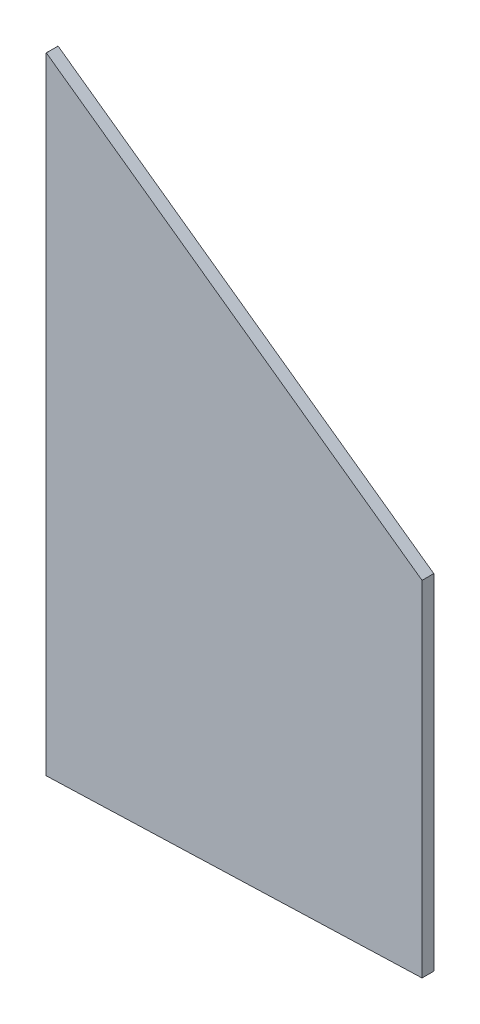
ISO-10303-21;
HEADER;
FILE_DESCRIPTION(('STEP AP214'),'2;1');
FILE_NAME('part.step','',(''),(''),'','','');
FILE_SCHEMA(('AUTOMOTIVE_DESIGN { 1 0 10303 214 1 1 1 1 }'));
ENDSEC;
DATA;
#1=APPLICATION_CONTEXT('core data for automotive mechanical design processes');
#2=APPLICATION_PROTOCOL_DEFINITION('international standard','automotive_design',2000,#1);
#3=PRODUCT_CONTEXT('',#1,'mechanical');
#4=PRODUCT('Part','Part','',(#3));
#5=PRODUCT_RELATED_PRODUCT_CATEGORY('part','',(#4));
#6=PRODUCT_DEFINITION_FORMATION('','',#4);
#7=PRODUCT_DEFINITION_CONTEXT('part definition',#1,'design');
#8=PRODUCT_DEFINITION('design','',#6,#7);
#9=PRODUCT_DEFINITION_SHAPE('','',#8);
#10=(LENGTH_UNIT() NAMED_UNIT(*) SI_UNIT(.MILLI.,.METRE.));
#11=(NAMED_UNIT(*) PLANE_ANGLE_UNIT() SI_UNIT($,.RADIAN.));
#12=(NAMED_UNIT(*) SI_UNIT($,.STERADIAN.) SOLID_ANGLE_UNIT());
#13=UNCERTAINTY_MEASURE_WITH_UNIT(LENGTH_MEASURE(1.E-05),#10,'distance_accuracy_value','');
#14=(GEOMETRIC_REPRESENTATION_CONTEXT(3) GLOBAL_UNCERTAINTY_ASSIGNED_CONTEXT((#13)) GLOBAL_UNIT_ASSIGNED_CONTEXT((#10,
#11,#12)) REPRESENTATION_CONTEXT('',''));
#15=CARTESIAN_POINT('',(0.,0.,0.));
#16=DIRECTION('',(0.,0.,1.));
#17=DIRECTION('',(1.,0.,0.));
#18=AXIS2_PLACEMENT_3D('',#15,#16,#17);
#19=CARTESIAN_POINT('',(0.,127.,2.38125));
#20=DIRECTION('',(-0.582122970157291,-0.813100761047026,0.));
#21=DIRECTION('',(0.813100761047026,-0.582122970157291,0.));
#22=AXIS2_PLACEMENT_3D('',#19,#20,#21);
#23=PLANE('',#22);
#24=DIRECTION('',(-0.813100761047026,0.582122970157291,0.));
#25=VECTOR('',#24,1.);
#26=CARTESIAN_POINT('',(0.,127.,-2.38125));
#27=LINE('',#26,#25);
#28=CARTESIAN_POINT('',(152.4,17.8923163007097,-2.38125));
#29=VERTEX_POINT('',#28);
#30=CARTESIAN_POINT('',(0.,127.,-2.38125));
#31=VERTEX_POINT('',#30);
#32=EDGE_CURVE('E157',#29,#31,#27,.T.);
#33=ORIENTED_EDGE('',*,*,#32,.T.);
#34=DIRECTION('',(0.,0.,-1.));
#35=VECTOR('',#34,1.);
#36=CARTESIAN_POINT('',(0.,127.,0.));
#37=LINE('',#36,#35);
#38=CARTESIAN_POINT('',(0.,127.,0.));
#39=VERTEX_POINT('',#38);
#40=EDGE_CURVE('E187',#39,#31,#37,.T.);
#41=ORIENTED_EDGE('',*,*,#40,.F.);
#42=DIRECTION('',(0.,0.,-1.));
#43=VECTOR('',#42,1.);
#44=CARTESIAN_POINT('',(0.,127.,2.38125));
#45=LINE('',#44,#43);
#46=CARTESIAN_POINT('',(0.,127.,2.38125));
#47=VERTEX_POINT('',#46);
#48=EDGE_CURVE('E12',#47,#39,#45,.T.);
#49=ORIENTED_EDGE('',*,*,#48,.F.);
#50=DIRECTION('',(-0.813100761047026,0.582122970157291,0.));
#51=VECTOR('',#50,1.);
#52=CARTESIAN_POINT('',(0.,127.,2.38125));
#53=LINE('',#52,#51);
#54=CARTESIAN_POINT('',(152.4,17.8923163007097,2.38125));
#55=VERTEX_POINT('',#54);
#56=EDGE_CURVE('E147',#55,#47,#53,.T.);
#57=ORIENTED_EDGE('',*,*,#56,.F.);
#58=DIRECTION('',(0.,0.,-1.));
#59=VECTOR('',#58,1.);
#60=CARTESIAN_POINT('',(152.4,17.8923163007097,2.38125));
#61=LINE('',#60,#59);
#62=EDGE_CURVE('E151',#55,#29,#61,.T.);
#63=ORIENTED_EDGE('',*,*,#62,.T.);
#64=EDGE_LOOP('',(#33,#41,#49,#57,#63));
#65=FACE_BOUND('',#64,.T.);
#66=ADVANCED_FACE('F81',(#65),#23,.F.);
#67=CARTESIAN_POINT('',(0.,-127.,2.38125));
#68=DIRECTION('',(-0.0340505599504526,0.999420111548222,0.));
#69=DIRECTION('',(-0.999420111548222,-0.0340505599504526,0.));
#70=AXIS2_PLACEMENT_3D('',#67,#68,#69);
#71=PLANE('',#70);
#72=DIRECTION('',(0.999420111548222,0.0340505599504526,0.));
#73=VECTOR('',#72,1.);
#74=CARTESIAN_POINT('',(0.,-127.,-2.38125));
#75=LINE('',#74,#73);
#76=CARTESIAN_POINT('',(0.,-127.,-2.38125));
#77=VERTEX_POINT('',#76);
#78=CARTESIAN_POINT('',(152.4,-121.80768369929,-2.38125));
#79=VERTEX_POINT('',#78);
#80=EDGE_CURVE('E110',#77,#79,#75,.T.);
#81=ORIENTED_EDGE('',*,*,#80,.T.);
#82=DIRECTION('',(0.,0.,-1.));
#83=VECTOR('',#82,1.);
#84=CARTESIAN_POINT('',(152.4,-121.80768369929,2.38125));
#85=LINE('',#84,#83);
#86=CARTESIAN_POINT('',(152.4,-121.80768369929,2.38125));
#87=VERTEX_POINT('',#86);
#88=EDGE_CURVE('E137',#87,#79,#85,.T.);
#89=ORIENTED_EDGE('',*,*,#88,.F.);
#90=DIRECTION('',(0.999420111548222,0.0340505599504526,0.));
#91=VECTOR('',#90,1.);
#92=CARTESIAN_POINT('',(0.,-127.,2.38125));
#93=LINE('',#92,#91);
#94=CARTESIAN_POINT('',(0.,-127.,2.38125));
#95=VERTEX_POINT('',#94);
#96=EDGE_CURVE('E140',#95,#87,#93,.T.);
#97=ORIENTED_EDGE('',*,*,#96,.F.);
#98=DIRECTION('',(0.,0.,-1.));
#99=VECTOR('',#98,1.);
#100=CARTESIAN_POINT('',(0.,-127.,2.38125));
#101=LINE('',#100,#99);
#102=CARTESIAN_POINT('',(0.,-127.,0.));
#103=VERTEX_POINT('',#102);
#104=EDGE_CURVE('E90',#95,#103,#101,.T.);
#105=ORIENTED_EDGE('',*,*,#104,.T.);
#106=DIRECTION('',(0.,0.,-1.));
#107=VECTOR('',#106,1.);
#108=CARTESIAN_POINT('',(0.,-127.,0.));
#109=LINE('',#108,#107);
#110=EDGE_CURVE('E204',#103,#77,#109,.T.);
#111=ORIENTED_EDGE('',*,*,#110,.T.);
#112=EDGE_LOOP('',(#81,#89,#97,#105,#111));
#113=FACE_BOUND('',#112,.T.);
#114=ADVANCED_FACE('F145',(#113),#71,.F.);
#115=CARTESIAN_POINT('',(152.4,17.8923163007097,2.38125));
#116=DIRECTION('',(-1.,0.,0.));
#117=DIRECTION('',(0.,0.,1.));
#118=AXIS2_PLACEMENT_3D('',#115,#116,#117);
#119=PLANE('',#118);
#120=DIRECTION('',(0.,1.,0.));
#121=VECTOR('',#120,1.);
#122=CARTESIAN_POINT('',(152.4,17.8923163007097,-2.38125));
#123=LINE('',#122,#121);
#124=EDGE_CURVE('E153',#79,#29,#123,.T.);
#125=ORIENTED_EDGE('',*,*,#124,.T.);
#126=ORIENTED_EDGE('',*,*,#62,.F.);
#127=DIRECTION('',(0.,1.,0.));
#128=VECTOR('',#127,1.);
#129=CARTESIAN_POINT('',(152.4,17.8923163007097,2.38125));
#130=LINE('',#129,#128);
#131=EDGE_CURVE('E98',#87,#55,#130,.T.);
#132=ORIENTED_EDGE('',*,*,#131,.F.);
#133=ORIENTED_EDGE('',*,*,#88,.T.);
#134=EDGE_LOOP('',(#125,#126,#132,#133));
#135=FACE_BOUND('',#134,.T.);
#136=ADVANCED_FACE('F171',(#135),#119,.F.);
#137=CARTESIAN_POINT('',(0.,0.,2.38125));
#138=DIRECTION('',(0.,0.,-1.));
#139=DIRECTION('',(-1.,0.,0.));
#140=AXIS2_PLACEMENT_3D('',#137,#138,#139);
#141=PLANE('',#140);
#142=ORIENTED_EDGE('',*,*,#56,.T.);
#143=DIRECTION('',(-1.,0.,0.));
#144=VECTOR('',#143,1.);
#145=CARTESIAN_POINT('',(0.,127.,2.38125));
#146=LINE('',#145,#144);
#147=CARTESIAN_POINT('',(-0.0555631177042853,127.,2.38125));
#148=VERTEX_POINT('',#147);
#149=EDGE_CURVE('E119',#47,#148,#146,.T.);
#150=ORIENTED_EDGE('',*,*,#149,.T.);
#151=DIRECTION('',(0.,-1.,0.));
#152=VECTOR('',#151,1.);
#153=CARTESIAN_POINT('',(-0.0555631177042853,127.,2.38125));
#154=LINE('',#153,#152);
#155=CARTESIAN_POINT('',(-0.0555631177042853,-127.,2.38125));
#156=VERTEX_POINT('',#155);
#157=EDGE_CURVE('E141',#148,#156,#154,.T.);
#158=ORIENTED_EDGE('',*,*,#157,.T.);
#159=DIRECTION('',(-1.,0.,0.));
#160=VECTOR('',#159,1.);
#161=CARTESIAN_POINT('',(0.,-127.,2.38125));
#162=LINE('',#161,#160);
#163=EDGE_CURVE('E132',#95,#156,#162,.T.);
#164=ORIENTED_EDGE('',*,*,#163,.F.);
#165=ORIENTED_EDGE('',*,*,#96,.T.);
#166=ORIENTED_EDGE('',*,*,#131,.T.);
#167=EDGE_LOOP('',(#142,#150,#158,#164,#165,#166));
#168=FACE_BOUND('',#167,.T.);
#169=ADVANCED_FACE('F139',(#168),#141,.F.);
#170=CARTESIAN_POINT('',(0.,0.,-2.38125));
#171=DIRECTION('',(0.,0.,-1.));
#172=DIRECTION('',(-1.,0.,0.));
#173=AXIS2_PLACEMENT_3D('',#170,#171,#172);
#174=PLANE('',#173);
#175=ORIENTED_EDGE('',*,*,#32,.F.);
#176=ORIENTED_EDGE('',*,*,#124,.F.);
#177=ORIENTED_EDGE('',*,*,#80,.F.);
#178=DIRECTION('',(-1.,0.,0.));
#179=VECTOR('',#178,1.);
#180=CARTESIAN_POINT('',(0.,-127.,-2.38125));
#181=LINE('',#180,#179);
#182=CARTESIAN_POINT('',(-0.0555631177042853,-127.,-2.38125));
#183=VERTEX_POINT('',#182);
#184=EDGE_CURVE('E208',#77,#183,#181,.T.);
#185=ORIENTED_EDGE('',*,*,#184,.T.);
#186=DIRECTION('',(0.,-1.,0.));
#187=VECTOR('',#186,1.);
#188=CARTESIAN_POINT('',(-0.0555631177042853,127.,-2.38125));
#189=LINE('',#188,#187);
#190=CARTESIAN_POINT('',(-0.0555631177042853,127.,-2.38125));
#191=VERTEX_POINT('',#190);
#192=EDGE_CURVE('E216',#191,#183,#189,.T.);
#193=ORIENTED_EDGE('',*,*,#192,.F.);
#194=DIRECTION('',(-1.,0.,0.));
#195=VECTOR('',#194,1.);
#196=CARTESIAN_POINT('',(0.,127.,-2.38125));
#197=LINE('',#196,#195);
#198=EDGE_CURVE('E181',#31,#191,#197,.T.);
#199=ORIENTED_EDGE('',*,*,#198,.F.);
#200=EDGE_LOOP('',(#175,#176,#177,#185,#193,#199));
#201=FACE_BOUND('',#200,.T.);
#202=ADVANCED_FACE('F174',(#201),#174,.T.);
#203=CARTESIAN_POINT('',(-51.054,127.,0.));
#204=DIRECTION('',(0.,-1.,0.));
#205=DIRECTION('',(0.,0.,-1.));
#206=AXIS2_PLACEMENT_3D('',#203,#204,#205);
#207=CYLINDRICAL_SURFACE('',#206,51.054);
#208=CARTESIAN_POINT('',(-51.054,127.,0.));
#209=DIRECTION('',(0.,1.,0.));
#210=DIRECTION('',(0.,0.,1.));
#211=AXIS2_PLACEMENT_3D('',#208,#209,#210);
#212=CIRCLE('',#211,51.054);
#213=EDGE_CURVE('E143',#148,#39,#212,.T.);
#214=ORIENTED_EDGE('',*,*,#213,.T.);
#215=CARTESIAN_POINT('',(-51.054,127.,0.));
#216=DIRECTION('',(0.,1.,0.));
#217=DIRECTION('',(0.,0.,1.));
#218=AXIS2_PLACEMENT_3D('',#215,#216,#217);
#219=CIRCLE('',#218,51.054);
#220=EDGE_CURVE('E210',#39,#191,#219,.T.);
#221=ORIENTED_EDGE('',*,*,#220,.T.);
#222=ORIENTED_EDGE('',*,*,#192,.T.);
#223=CARTESIAN_POINT('',(-51.054,-127.,0.));
#224=DIRECTION('',(0.,1.,0.));
#225=DIRECTION('',(0.,0.,1.));
#226=AXIS2_PLACEMENT_3D('',#223,#224,#225);
#227=CIRCLE('',#226,51.054);
#228=EDGE_CURVE('E207',#103,#183,#227,.T.);
#229=ORIENTED_EDGE('',*,*,#228,.F.);
#230=CARTESIAN_POINT('',(-51.054,-127.,0.));
#231=DIRECTION('',(0.,1.,0.));
#232=DIRECTION('',(0.,0.,1.));
#233=AXIS2_PLACEMENT_3D('',#230,#231,#232);
#234=CIRCLE('',#233,51.054);
#235=EDGE_CURVE('E134',#156,#103,#234,.T.);
#236=ORIENTED_EDGE('',*,*,#235,.F.);
#237=ORIENTED_EDGE('',*,*,#157,.F.);
#238=EDGE_LOOP('',(#214,#221,#222,#229,#236,#237));
#239=FACE_BOUND('',#238,.T.);
#240=ADVANCED_FACE('F214',(#239),#207,.F.);
#241=CARTESIAN_POINT('',(0.,127.,0.));
#242=DIRECTION('',(0.,1.,0.));
#243=DIRECTION('',(0.,0.,1.));
#244=AXIS2_PLACEMENT_3D('',#241,#242,#243);
#245=PLANE('',#244);
#246=ORIENTED_EDGE('',*,*,#213,.F.);
#247=ORIENTED_EDGE('',*,*,#149,.F.);
#248=ORIENTED_EDGE('',*,*,#48,.T.);
#249=EDGE_LOOP('',(#246,#247,#248));
#250=FACE_BOUND('',#249,.T.);
#251=ADVANCED_FACE('F229',(#250),#245,.T.);
#252=CARTESIAN_POINT('',(0.,-127.,0.));
#253=DIRECTION('',(0.,1.,0.));
#254=DIRECTION('',(0.,0.,1.));
#255=AXIS2_PLACEMENT_3D('',#252,#253,#254);
#256=PLANE('',#255);
#257=ORIENTED_EDGE('',*,*,#235,.T.);
#258=ORIENTED_EDGE('',*,*,#104,.F.);
#259=ORIENTED_EDGE('',*,*,#163,.T.);
#260=EDGE_LOOP('',(#257,#258,#259));
#261=FACE_BOUND('',#260,.T.);
#262=ADVANCED_FACE('F130',(#261),#256,.F.);
#263=CARTESIAN_POINT('',(0.,127.,0.));
#264=DIRECTION('',(0.,1.,0.));
#265=DIRECTION('',(0.,0.,1.));
#266=AXIS2_PLACEMENT_3D('',#263,#264,#265);
#267=PLANE('',#266);
#268=ORIENTED_EDGE('',*,*,#220,.F.);
#269=ORIENTED_EDGE('',*,*,#40,.T.);
#270=ORIENTED_EDGE('',*,*,#198,.T.);
#271=EDGE_LOOP('',(#268,#269,#270));
#272=FACE_BOUND('',#271,.T.);
#273=ADVANCED_FACE('F237',(#272),#267,.T.);
#274=CARTESIAN_POINT('',(0.,-127.,0.));
#275=DIRECTION('',(0.,1.,0.));
#276=DIRECTION('',(0.,0.,1.));
#277=AXIS2_PLACEMENT_3D('',#274,#275,#276);
#278=PLANE('',#277);
#279=ORIENTED_EDGE('',*,*,#228,.T.);
#280=ORIENTED_EDGE('',*,*,#184,.F.);
#281=ORIENTED_EDGE('',*,*,#110,.F.);
#282=EDGE_LOOP('',(#279,#280,#281));
#283=FACE_BOUND('',#282,.T.);
#284=ADVANCED_FACE('F206',(#283),#278,.F.);
#285=CLOSED_SHELL('',(#66,#114,#136,#169,#202,#240,#251,#262,#273,#284));
#286=MANIFOLD_SOLID_BREP('B2',#285);
#287=ADVANCED_BREP_SHAPE_REPRESENTATION('',(#18,#286),#14);
#288=SHAPE_DEFINITION_REPRESENTATION(#9,#287);
ENDSEC;
END-ISO-10303-21;
